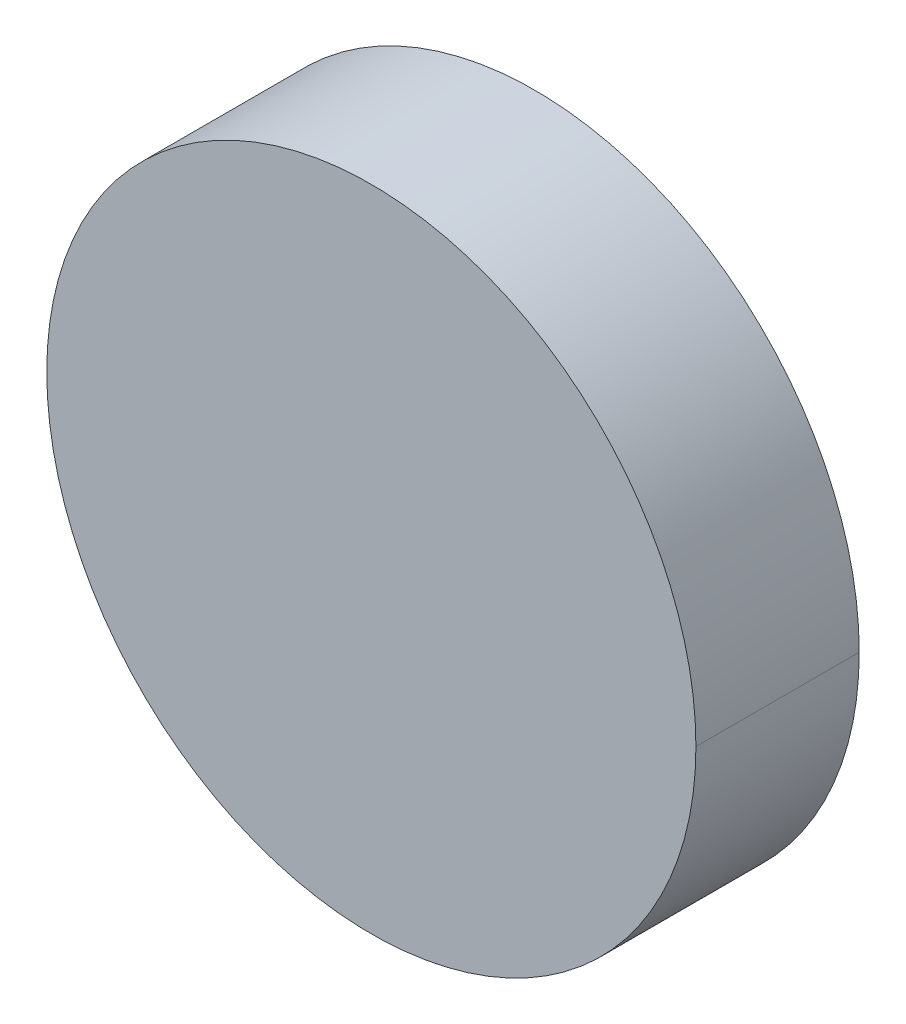
ISO-10303-21;
HEADER;
FILE_DESCRIPTION(('STEP AP214'),'2;1');
FILE_NAME('part.step','',(''),(''),'','','');
FILE_SCHEMA(('AUTOMOTIVE_DESIGN { 1 0 10303 214 1 1 1 1 }'));
ENDSEC;
DATA;
#1=APPLICATION_CONTEXT('core data for automotive mechanical design processes');
#2=APPLICATION_PROTOCOL_DEFINITION('international standard','automotive_design',2000,#1);
#3=PRODUCT_CONTEXT('',#1,'mechanical');
#4=PRODUCT('Part','Part','',(#3));
#5=PRODUCT_RELATED_PRODUCT_CATEGORY('part','',(#4));
#6=PRODUCT_DEFINITION_FORMATION('','',#4);
#7=PRODUCT_DEFINITION_CONTEXT('part definition',#1,'design');
#8=PRODUCT_DEFINITION('design','',#6,#7);
#9=PRODUCT_DEFINITION_SHAPE('','',#8);
#10=(LENGTH_UNIT() NAMED_UNIT(*) SI_UNIT(.MILLI.,.METRE.));
#11=(NAMED_UNIT(*) PLANE_ANGLE_UNIT() SI_UNIT($,.RADIAN.));
#12=(NAMED_UNIT(*) SI_UNIT($,.STERADIAN.) SOLID_ANGLE_UNIT());
#13=UNCERTAINTY_MEASURE_WITH_UNIT(LENGTH_MEASURE(1.E-05),#10,'distance_accuracy_value','');
#14=(GEOMETRIC_REPRESENTATION_CONTEXT(3) GLOBAL_UNCERTAINTY_ASSIGNED_CONTEXT((#13)) GLOBAL_UNIT_ASSIGNED_CONTEXT((#10,
#11,#12)) REPRESENTATION_CONTEXT('',''));
#15=CARTESIAN_POINT('',(0.,0.,0.));
#16=DIRECTION('',(0.,0.,1.));
#17=DIRECTION('',(1.,0.,0.));
#18=AXIS2_PLACEMENT_3D('',#15,#16,#17);
#19=CARTESIAN_POINT('',(4.305,1.03,1.7));
#20=DIRECTION('',(0.,0.,1.));
#21=DIRECTION('',(1.,0.,0.));
#22=AXIS2_PLACEMENT_3D('',#19,#20,#21);
#23=CYLINDRICAL_SURFACE('',#22,0.3975);
#24=CARTESIAN_POINT('',(4.305,1.03,1.7));
#25=DIRECTION('',(0.,0.,1.));
#26=DIRECTION('',(1.,0.,0.));
#27=AXIS2_PLACEMENT_3D('',#24,#25,#26);
#28=CIRCLE('',#27,0.3975);
#29=CARTESIAN_POINT('',(4.7025,1.03,1.7));
#30=VERTEX_POINT('',#29);
#31=CARTESIAN_POINT('',(3.9075,1.03,1.7));
#32=VERTEX_POINT('',#31);
#33=EDGE_CURVE('E11',#30,#32,#28,.T.);
#34=ORIENTED_EDGE('',*,*,#33,.T.);
#35=DIRECTION('',(0.,0.,1.));
#36=VECTOR('',#35,1.);
#37=CARTESIAN_POINT('',(3.9075,1.03,1.7));
#38=LINE('',#37,#36);
#39=CARTESIAN_POINT('',(3.9075,1.03,1.9));
#40=VERTEX_POINT('',#39);
#41=EDGE_CURVE('E24',#32,#40,#38,.T.);
#42=ORIENTED_EDGE('',*,*,#41,.T.);
#43=CARTESIAN_POINT('',(4.305,1.03,1.9));
#44=DIRECTION('',(0.,0.,-1.));
#45=DIRECTION('',(1.,0.,0.));
#46=AXIS2_PLACEMENT_3D('',#43,#44,#45);
#47=CIRCLE('',#46,0.3975);
#48=CARTESIAN_POINT('',(4.7025,1.03,1.9));
#49=VERTEX_POINT('',#48);
#50=EDGE_CURVE('E39',#40,#49,#47,.T.);
#51=ORIENTED_EDGE('',*,*,#50,.T.);
#52=DIRECTION('',(0.,0.,1.));
#53=VECTOR('',#52,1.);
#54=CARTESIAN_POINT('',(4.7025,1.03,1.7));
#55=LINE('',#54,#53);
#56=EDGE_CURVE('E41',#30,#49,#55,.T.);
#57=ORIENTED_EDGE('',*,*,#56,.F.);
#58=EDGE_LOOP('',(#34,#42,#51,#57));
#59=FACE_BOUND('',#58,.T.);
#60=ADVANCED_FACE('F17',(#59),#23,.T.);
#61=CARTESIAN_POINT('',(4.305,1.03,1.7));
#62=DIRECTION('',(0.,0.,1.));
#63=DIRECTION('',(1.,0.,0.));
#64=AXIS2_PLACEMENT_3D('',#61,#62,#63);
#65=CYLINDRICAL_SURFACE('',#64,0.3975);
#66=ORIENTED_EDGE('',*,*,#41,.F.);
#67=CARTESIAN_POINT('',(4.305,1.03,1.7));
#68=DIRECTION('',(0.,0.,1.));
#69=DIRECTION('',(1.,0.,0.));
#70=AXIS2_PLACEMENT_3D('',#67,#68,#69);
#71=CIRCLE('',#70,0.3975);
#72=EDGE_CURVE('E50',#32,#30,#71,.T.);
#73=ORIENTED_EDGE('',*,*,#72,.T.);
#74=ORIENTED_EDGE('',*,*,#56,.T.);
#75=CARTESIAN_POINT('',(4.305,1.03,1.9));
#76=DIRECTION('',(0.,0.,-1.));
#77=DIRECTION('',(1.,0.,0.));
#78=AXIS2_PLACEMENT_3D('',#75,#76,#77);
#79=CIRCLE('',#78,0.3975);
#80=EDGE_CURVE('E49',#49,#40,#79,.T.);
#81=ORIENTED_EDGE('',*,*,#80,.T.);
#82=EDGE_LOOP('',(#66,#73,#74,#81));
#83=FACE_BOUND('',#82,.T.);
#84=ADVANCED_FACE('F48',(#83),#65,.T.);
#85=CARTESIAN_POINT('',(4.305,1.03,1.7));
#86=DIRECTION('',(0.,0.,1.));
#87=DIRECTION('',(1.,0.,0.));
#88=AXIS2_PLACEMENT_3D('',#85,#86,#87);
#89=PLANE('',#88);
#90=ORIENTED_EDGE('',*,*,#33,.F.);
#91=ORIENTED_EDGE('',*,*,#72,.F.);
#92=EDGE_LOOP('',(#90,#91));
#93=FACE_BOUND('',#92,.T.);
#94=ADVANCED_FACE('F56',(#93),#89,.F.);
#95=CARTESIAN_POINT('',(4.305,1.03,1.9));
#96=DIRECTION('',(0.,0.,1.));
#97=DIRECTION('',(1.,0.,0.));
#98=AXIS2_PLACEMENT_3D('',#95,#96,#97);
#99=PLANE('',#98);
#100=ORIENTED_EDGE('',*,*,#80,.F.);
#101=ORIENTED_EDGE('',*,*,#50,.F.);
#102=EDGE_LOOP('',(#100,#101));
#103=FACE_BOUND('',#102,.T.);
#104=ADVANCED_FACE('F52',(#103),#99,.T.);
#105=CLOSED_SHELL('',(#60,#84,#94,#104));
#106=MANIFOLD_SOLID_BREP('B1',#105);
#107=ADVANCED_BREP_SHAPE_REPRESENTATION('',(#18,#106),#14);
#108=SHAPE_DEFINITION_REPRESENTATION(#9,#107);
ENDSEC;
END-ISO-10303-21;
